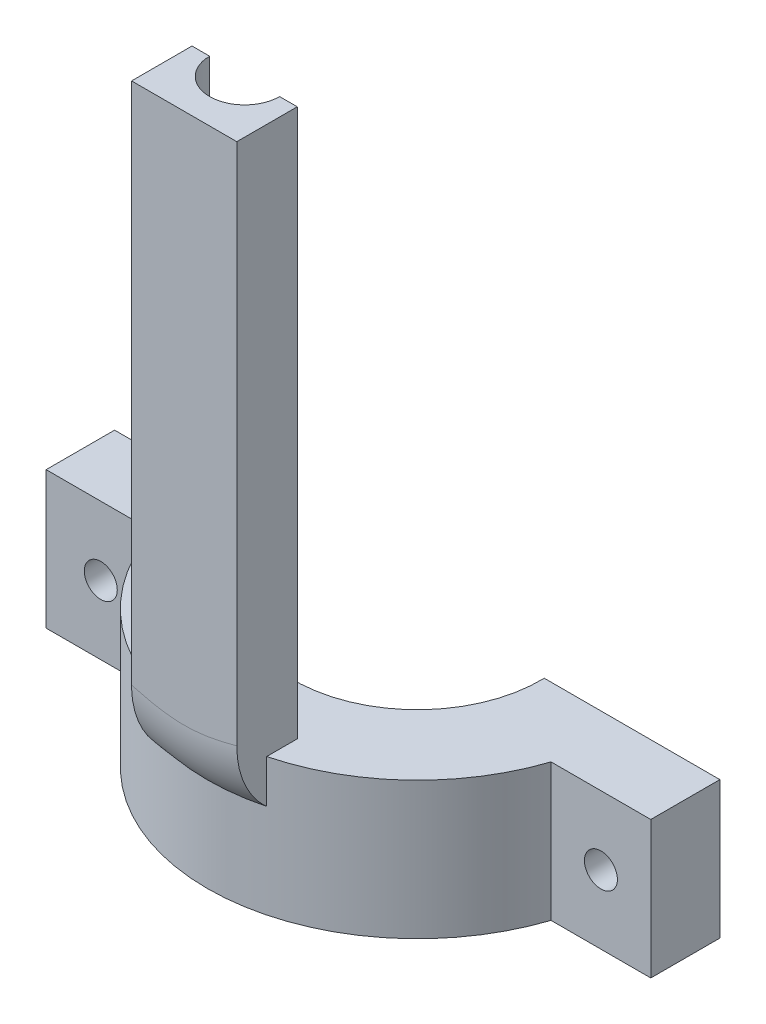
ISO-10303-21;
HEADER;
FILE_DESCRIPTION(('STEP AP214'),'2;1');
FILE_NAME('part.step','',(''),(''),'','','');
FILE_SCHEMA(('AUTOMOTIVE_DESIGN { 1 0 10303 214 1 1 1 1 }'));
ENDSEC;
DATA;
#1=APPLICATION_CONTEXT('core data for automotive mechanical design processes');
#2=APPLICATION_PROTOCOL_DEFINITION('international standard','automotive_design',2000,#1);
#3=PRODUCT_CONTEXT('',#1,'mechanical');
#4=PRODUCT('Part','Part','',(#3));
#5=PRODUCT_RELATED_PRODUCT_CATEGORY('part','',(#4));
#6=PRODUCT_DEFINITION_FORMATION('','',#4);
#7=PRODUCT_DEFINITION_CONTEXT('part definition',#1,'design');
#8=PRODUCT_DEFINITION('design','',#6,#7);
#9=PRODUCT_DEFINITION_SHAPE('','',#8);
#10=(LENGTH_UNIT() NAMED_UNIT(*) SI_UNIT(.MILLI.,.METRE.));
#11=(NAMED_UNIT(*) PLANE_ANGLE_UNIT() SI_UNIT($,.RADIAN.));
#12=(NAMED_UNIT(*) SI_UNIT($,.STERADIAN.) SOLID_ANGLE_UNIT());
#13=UNCERTAINTY_MEASURE_WITH_UNIT(LENGTH_MEASURE(1.E-05),#10,'distance_accuracy_value','');
#14=(GEOMETRIC_REPRESENTATION_CONTEXT(3) GLOBAL_UNCERTAINTY_ASSIGNED_CONTEXT((#13)) GLOBAL_UNIT_ASSIGNED_CONTEXT((#10,
#11,#12)) REPRESENTATION_CONTEXT('',''));
#15=CARTESIAN_POINT('',(0.,0.,0.));
#16=DIRECTION('',(0.,0.,1.));
#17=DIRECTION('',(1.,0.,0.));
#18=AXIS2_PLACEMENT_3D('',#15,#16,#17);
#19=CARTESIAN_POINT('',(0.,10.,0.));
#20=DIRECTION('',(0.,-1.,0.));
#21=DIRECTION('',(0.,0.,-1.));
#22=AXIS2_PLACEMENT_3D('',#19,#20,#21);
#23=CYLINDRICAL_SURFACE('',#22,24.32);
#24=CARTESIAN_POINT('',(0.,10.,0.));
#25=DIRECTION('',(0.,1.,0.));
#26=DIRECTION('',(1.,0.,0.));
#27=AXIS2_PLACEMENT_3D('',#24,#25,#26);
#28=CIRCLE('',#27,24.32);
#29=CARTESIAN_POINT('',(-23.1221453744989,10.,7.53848746636495));
#30=VERTEX_POINT('',#29);
#31=CARTESIAN_POINT('',(-6.09413412364548,10.,23.5440848045325));
#32=VERTEX_POINT('',#31);
#33=EDGE_CURVE('E254',#30,#32,#28,.T.);
#34=ORIENTED_EDGE('',*,*,#33,.F.);
#35=DIRECTION('',(0.,-1.,0.));
#36=VECTOR('',#35,1.);
#37=CARTESIAN_POINT('',(-23.1221453744989,10.,7.53848746636495));
#38=LINE('',#37,#36);
#39=CARTESIAN_POINT('',(-23.1221453744989,-5.9,7.53848746636495));
#40=VERTEX_POINT('',#39);
#41=EDGE_CURVE('E189',#30,#40,#38,.T.);
#42=ORIENTED_EDGE('',*,*,#41,.T.);
#43=CARTESIAN_POINT('',(0.,-5.9,0.));
#44=DIRECTION('',(0.,-1.,0.));
#45=DIRECTION('',(1.,0.,0.));
#46=AXIS2_PLACEMENT_3D('',#43,#44,#45);
#47=CIRCLE('',#46,24.32);
#48=CARTESIAN_POINT('',(23.0980347749765,-5.9,7.61204240227137));
#49=VERTEX_POINT('',#48);
#50=EDGE_CURVE('E214',#49,#40,#47,.T.);
#51=ORIENTED_EDGE('',*,*,#50,.F.);
#52=DIRECTION('',(0.,-1.,0.));
#53=VECTOR('',#52,1.);
#54=CARTESIAN_POINT('',(23.0980347749765,10.,7.61204240227137));
#55=LINE('',#54,#53);
#56=CARTESIAN_POINT('',(23.0980347749765,10.,7.61204240227137));
#57=VERTEX_POINT('',#56);
#58=EDGE_CURVE('E207',#49,#57,#55,.F.);
#59=ORIENTED_EDGE('',*,*,#58,.T.);
#60=CARTESIAN_POINT('',(6.09413412364551,10.,23.5440848045325));
#61=VERTEX_POINT('',#60);
#62=EDGE_CURVE('E255',#61,#57,#28,.T.);
#63=ORIENTED_EDGE('',*,*,#62,.F.);
#64=DIRECTION('',(0.,-1.,0.));
#65=VECTOR('',#64,1.);
#66=CARTESIAN_POINT('',(6.09413412364551,10.,23.5440848045325));
#67=LINE('',#66,#65);
#68=CARTESIAN_POINT('',(6.09413412364551,5.,23.5440848045325));
#69=VERTEX_POINT('',#68);
#70=EDGE_CURVE('E264',#61,#69,#67,.T.);
#71=ORIENTED_EDGE('',*,*,#70,.T.);
#72=CARTESIAN_POINT('',(0.,5.,0.));
#73=DIRECTION('',(0.,-1.,0.));
#74=DIRECTION('',(0.,0.,-1.));
#75=AXIS2_PLACEMENT_3D('',#72,#73,#74);
#76=CIRCLE('',#75,24.32);
#77=CARTESIAN_POINT('',(-6.09413412364548,5.,23.5440848045325));
#78=VERTEX_POINT('',#77);
#79=EDGE_CURVE('E261',#69,#78,#76,.T.);
#80=ORIENTED_EDGE('',*,*,#79,.T.);
#81=DIRECTION('',(0.,-1.,0.));
#82=VECTOR('',#81,1.);
#83=CARTESIAN_POINT('',(-6.09413412364548,10.,23.5440848045325));
#84=LINE('',#83,#82);
#85=EDGE_CURVE('E258',#78,#32,#84,.F.);
#86=ORIENTED_EDGE('',*,*,#85,.T.);
#87=EDGE_LOOP('',(#34,#42,#51,#59,#63,#71,#80,#86));
#88=FACE_BOUND('',#87,.T.);
#89=ADVANCED_FACE('F45',(#88),#23,.T.);
#90=CARTESIAN_POINT('',(0.,10.,0.));
#91=DIRECTION('',(0.,1.,0.));
#92=DIRECTION('',(0.,0.,1.));
#93=AXIS2_PLACEMENT_3D('',#90,#91,#92);
#94=PLANE('',#93);
#95=DIRECTION('',(1.,0.,0.));
#96=VECTOR('',#95,1.);
#97=CARTESIAN_POINT('',(34.65,10.,-0.387957597728635));
#98=LINE('',#97,#96);
#99=CARTESIAN_POINT('',(-35.45,10.,-0.387957597728635));
#100=VERTEX_POINT('',#99);
#101=CARTESIAN_POINT('',(-14.3147437595776,10.,-0.387957597728635));
#102=VERTEX_POINT('',#101);
#103=EDGE_CURVE('E160',#100,#102,#98,.T.);
#104=ORIENTED_EDGE('',*,*,#103,.F.);
#105=DIRECTION('',(0.,0.,1.));
#106=VECTOR('',#105,1.);
#107=CARTESIAN_POINT('',(-35.45,10.,-8.46151253363505));
#108=LINE('',#107,#106);
#109=CARTESIAN_POINT('',(-35.45,10.,7.53848746636495));
#110=VERTEX_POINT('',#109);
#111=EDGE_CURVE('E171',#100,#110,#108,.T.);
#112=ORIENTED_EDGE('',*,*,#111,.T.);
#113=DIRECTION('',(1.,0.,0.));
#114=VECTOR('',#113,1.);
#115=CARTESIAN_POINT('',(-35.45,10.,7.53848746636495));
#116=LINE('',#115,#114);
#117=EDGE_CURVE('E184',#110,#30,#116,.T.);
#118=ORIENTED_EDGE('',*,*,#117,.T.);
#119=ORIENTED_EDGE('',*,*,#33,.T.);
#120=DIRECTION('',(0.,0.,1.));
#121=VECTOR('',#120,1.);
#122=CARTESIAN_POINT('',(-6.09413412364548,10.,0.));
#123=LINE('',#122,#121);
#124=CARTESIAN_POINT('',(-6.09413412364548,10.,20.));
#125=VERTEX_POINT('',#124);
#126=EDGE_CURVE('E248',#125,#32,#123,.T.);
#127=ORIENTED_EDGE('',*,*,#126,.F.);
#128=DIRECTION('',(1.,0.,0.));
#129=VECTOR('',#128,1.);
#130=CARTESIAN_POINT('',(0.,10.,20.));
#131=LINE('',#130,#129);
#132=CARTESIAN_POINT('',(6.09413412364551,10.,20.));
#133=VERTEX_POINT('',#132);
#134=EDGE_CURVE('E267',#125,#133,#131,.T.);
#135=ORIENTED_EDGE('',*,*,#134,.T.);
#136=DIRECTION('',(0.,0.,-1.));
#137=VECTOR('',#136,1.);
#138=CARTESIAN_POINT('',(6.09413412364551,10.,0.));
#139=LINE('',#138,#137);
#140=EDGE_CURVE('E251',#61,#133,#139,.T.);
#141=ORIENTED_EDGE('',*,*,#140,.F.);
#142=ORIENTED_EDGE('',*,*,#62,.T.);
#143=DIRECTION('',(1.,0.,0.));
#144=VECTOR('',#143,1.);
#145=CARTESIAN_POINT('',(23.,10.,7.61204240227137));
#146=LINE('',#145,#144);
#147=CARTESIAN_POINT('',(34.65,10.,7.61204240227137));
#148=VERTEX_POINT('',#147);
#149=EDGE_CURVE('E204',#57,#148,#146,.T.);
#150=ORIENTED_EDGE('',*,*,#149,.T.);
#151=DIRECTION('',(0.,0.,1.));
#152=VECTOR('',#151,1.);
#153=CARTESIAN_POINT('',(34.65,10.,7.61204240227137));
#154=LINE('',#153,#152);
#155=CARTESIAN_POINT('',(34.65,10.,-0.387957597728635));
#156=VERTEX_POINT('',#155);
#157=EDGE_CURVE('E196',#156,#148,#154,.T.);
#158=ORIENTED_EDGE('',*,*,#157,.F.);
#159=CARTESIAN_POINT('',(14.3147437595776,10.,-0.387957597728635));
#160=VERTEX_POINT('',#159);
#161=EDGE_CURVE('E62',#160,#156,#98,.T.);
#162=ORIENTED_EDGE('',*,*,#161,.F.);
#163=CARTESIAN_POINT('',(0.,10.,0.));
#164=DIRECTION('',(0.,1.,0.));
#165=DIRECTION('',(0.,0.,1.));
#166=AXIS2_PLACEMENT_3D('',#163,#164,#165);
#167=CIRCLE('',#166,14.32);
#168=EDGE_CURVE('E174',#102,#160,#167,.T.);
#169=ORIENTED_EDGE('',*,*,#168,.F.);
#170=EDGE_LOOP('',(#104,#112,#118,#119,#127,#135,#141,#142,#150,#158,#162,#169));
#171=FACE_BOUND('',#170,.T.);
#172=ADVANCED_FACE('F169',(#171),#94,.T.);
#173=CARTESIAN_POINT('',(0.,10.,0.));
#174=DIRECTION('',(0.,-1.,0.));
#175=DIRECTION('',(0.,0.,-1.));
#176=AXIS2_PLACEMENT_3D('',#173,#174,#175);
#177=CYLINDRICAL_SURFACE('',#176,14.32);
#178=DIRECTION('',(0.,-1.,0.));
#179=VECTOR('',#178,1.);
#180=CARTESIAN_POINT('',(-14.3147437595776,10.,-0.387957597728635));
#181=LINE('',#180,#179);
#182=CARTESIAN_POINT('',(-14.3147437595776,-5.9,-0.387957597728635));
#183=VERTEX_POINT('',#182);
#184=EDGE_CURVE('E368',#102,#183,#181,.T.);
#185=ORIENTED_EDGE('',*,*,#184,.F.);
#186=ORIENTED_EDGE('',*,*,#168,.T.);
#187=DIRECTION('',(0.,-1.,0.));
#188=VECTOR('',#187,1.);
#189=CARTESIAN_POINT('',(14.3147437595776,10.,-0.387957597728635));
#190=LINE('',#189,#188);
#191=CARTESIAN_POINT('',(14.3147437595776,-5.9,-0.387957597728635));
#192=VERTEX_POINT('',#191);
#193=EDGE_CURVE('E367',#192,#160,#190,.F.);
#194=ORIENTED_EDGE('',*,*,#193,.F.);
#195=CARTESIAN_POINT('',(0.,-5.9,0.));
#196=DIRECTION('',(0.,-1.,0.));
#197=DIRECTION('',(0.,0.,-1.));
#198=AXIS2_PLACEMENT_3D('',#195,#196,#197);
#199=CIRCLE('',#198,14.32);
#200=EDGE_CURVE('E211',#192,#183,#199,.T.);
#201=ORIENTED_EDGE('',*,*,#200,.T.);
#202=EDGE_LOOP('',(#185,#186,#194,#201));
#203=FACE_BOUND('',#202,.T.);
#204=ADVANCED_FACE('F328',(#203),#177,.F.);
#205=CARTESIAN_POINT('',(6.09413412364551,11.3789067462464,20.));
#206=DIRECTION('',(1.,0.,0.));
#207=DIRECTION('',(0.,1.,0.));
#208=AXIS2_PLACEMENT_3D('',#205,#206,#207);
#209=PLANE('',#208);
#210=DIRECTION('',(0.,1.,0.));
#211=VECTOR('',#210,1.);
#212=CARTESIAN_POINT('',(6.09413412364551,0.,27.));
#213=LINE('',#212,#211);
#214=CARTESIAN_POINT('',(6.09413412364551,12.7976720228891,27.));
#215=VERTEX_POINT('',#214);
#216=CARTESIAN_POINT('',(6.09413412364551,73.3989067462464,27.));
#217=VERTEX_POINT('',#216);
#218=EDGE_CURVE('E220',#215,#217,#213,.T.);
#219=ORIENTED_EDGE('',*,*,#218,.F.);
#220=CARTESIAN_POINT('',(-11.5257785129935,5.,21.4153876843128));
#221=CARTESIAN_POINT('',(-10.7979053131753,7.65008264736126,27.));
#222=CARTESIAN_POINT('',(-9.14941314927273,13.6520078164162,27.));
#223=CARTESIAN_POINT('',(-11.3378264558306,5.,21.5165415273467));
#224=CARTESIAN_POINT('',(-10.5977190150874,7.67592773256537,27.));
#225=CARTESIAN_POINT('',(-8.95699097159141,13.5991609913679,27.));
#226=CARTESIAN_POINT('',(-11.1460319715212,5.,21.6165766212209));
#227=CARTESIAN_POINT('',(-10.3945121750637,7.69956177198486,27.));
#228=CARTESIAN_POINT('',(-8.76473479564352,13.5457180194451,27.));
#229=CARTESIAN_POINT('',(-10.7546503422947,5.,21.8139393115762));
#230=CARTESIAN_POINT('',(-9.98372044979291,7.7424773362833,27.));
#231=CARTESIAN_POINT('',(-8.38042645046281,13.4381092470189,27.));
#232=CARTESIAN_POINT('',(-10.5550632698645,5.,21.9112669332277));
#233=CARTESIAN_POINT('',(-9.77611351528495,7.76179325123868,27.));
#234=CARTESIAN_POINT('',(-8.18837427934939,13.3839434532422,27.));
#235=CARTESIAN_POINT('',(-9.94431907565416,5.,22.1985461577991));
#236=CARTESIAN_POINT('',(-9.14885213394715,7.81352290034882,27.));
#237=CARTESIAN_POINT('',(-7.61220657297191,13.22103063927,27.));
#238=CARTESIAN_POINT('',(-9.52129614779497,5.,22.3837303996122));
#239=CARTESIAN_POINT('',(-8.72069725784056,7.84021218154117,27.));
#240=CARTESIAN_POINT('',(-7.22819978185598,13.1119017558189,27.));
#241=CARTESIAN_POINT('',(-8.63772055262134,5.,22.7394315659862));
#242=CARTESIAN_POINT('',(-7.84353246652724,7.88048181034984,27.));
#243=CARTESIAN_POINT('',(-6.4544973196288,12.8955289411152,27.));
#244=CARTESIAN_POINT('',(-8.1767669787866,5.,22.9097377272702));
#245=CARTESIAN_POINT('',(-7.39387830488988,7.89407883854164,27.));
#246=CARTESIAN_POINT('',(-6.06479023399695,12.7883252617966,27.));
#247=CARTESIAN_POINT('',(-7.22238885506042,5.,23.2282682940278));
#248=CARTESIAN_POINT('',(-6.47972873308056,7.91107804287509,27.));
#249=CARTESIAN_POINT('',(-5.28314920889017,12.5823108903619,27.));
#250=CARTESIAN_POINT('',(-6.72896658300259,5.,23.3764942461572));
#251=CARTESIAN_POINT('',(-6.01469205068409,7.91459380433553,27.));
#252=CARTESIAN_POINT('',(-4.89121542738735,12.4834996105907,27.));
#253=CARTESIAN_POINT('',(-5.74213430572935,5.,23.6375702974723));
#254=CARTESIAN_POINT('',(-5.0991989162276,7.91522453305528,27.));
#255=CARTESIAN_POINT('',(-4.12772908649979,12.3055802622899,27.));
#256=CARTESIAN_POINT('',(-5.25051969719049,5.,23.7520151881606));
#257=CARTESIAN_POINT('',(-4.64915990929392,7.91275759321577,27.));
#258=CARTESIAN_POINT('',(-3.7563735538088,12.2256431141343,27.));
#259=CARTESIAN_POINT('',(-4.24350843771677,5.,23.9524188803053));
#260=CARTESIAN_POINT('',(-3.73858710128888,7.90542390752773,27.));
#261=CARTESIAN_POINT('',(-3.01022923457598,12.0834322522819,27.));
#262=CARTESIAN_POINT('',(-3.72811282241121,5.,24.0383789209053));
#263=CARTESIAN_POINT('',(-3.27732708083323,7.90056510345296,27.));
#264=CARTESIAN_POINT('',(-2.6354405981096,12.0211577702435,27.));
#265=CARTESIAN_POINT('',(-2.68205288137887,5.,24.1773797668994));
#266=CARTESIAN_POINT('',(-2.34949819349694,7.89141005855021,27.));
#267=CARTESIAN_POINT('',(-1.88477518632753,11.9194410274715,27.));
#268=CARTESIAN_POINT('',(-2.15148701818676,5.,24.2305973362875));
#269=CARTESIAN_POINT('',(-1.88213295811772,7.88710015542467,27.));
#270=CARTESIAN_POINT('',(-1.5089154585511,11.8798762449882,27.));
#271=CARTESIAN_POINT('',(-1.08060011106596,5.,24.3018991265428));
#272=CARTESIAN_POINT('',(-0.943633879149647,7.8811130465204,27.));
#273=CARTESIAN_POINT('',(-0.755360447939881,11.8266874539024,27.));
#274=CARTESIAN_POINT('',(-0.540280852320594,5.,24.3199897122641));
#275=CARTESIAN_POINT('',(-0.471553746109246,7.87942384710444,27.));
#276=CARTESIAN_POINT('',(-0.377665510073063,11.8130587458067,27.));
#277=CARTESIAN_POINT('',(0.415563524107193,5.,24.3200079129425));
#278=CARTESIAN_POINT('',(0.362701179995349,7.87941137976263,27.));
#279=CARTESIAN_POINT('',(0.290486214002005,11.8130367419587,27.));
#280=CARTESIAN_POINT('',(0.8311044053832,5.,24.3093193187234));
#281=CARTESIAN_POINT('',(0.725606103461193,7.88040091902309,27.));
#282=CARTESIAN_POINT('',(0.580955018191015,11.821082714053,27.));
#283=CARTESIAN_POINT('',(1.65769416774632,5.,24.2669658589697));
#284=CARTESIAN_POINT('',(1.44880197400916,7.88407079544688,27.));
#285=CARTESIAN_POINT('',(1.16102980376904,11.8527674989445,27.));
#286=CARTESIAN_POINT('',(2.06874311154208,5.,24.2353012866466));
#287=CARTESIAN_POINT('',(1.80952981199053,7.88675541626908,27.));
#288=CARTESIAN_POINT('',(1.45063579716197,11.8764060937811,27.));
#289=CARTESIAN_POINT('',(2.88317009452338,5.,24.1519713857434));
#290=CARTESIAN_POINT('',(2.52722407022133,7.89306424940141,27.));
#291=CARTESIAN_POINT('',(2.02889590033091,11.938023962612,27.));
#292=CARTESIAN_POINT('',(3.28653048164396,5.,24.100264765863));
#293=CARTESIAN_POINT('',(2.88458986166025,7.89669636292086,27.));
#294=CARTESIAN_POINT('',(2.31754679602359,11.9760328387406,27.));
#295=CARTESIAN_POINT('',(4.08149088350606,5.,23.9784400957139));
#296=CARTESIAN_POINT('',(3.59336443014339,7.9037643716686,27.));
#297=CARTESIAN_POINT('',(2.89292480748212,12.0644460865763,27.));
#298=CARTESIAN_POINT('',(4.47309046582008,5.,23.9083213693804));
#299=CARTESIAN_POINT('',(3.94514261545785,7.90720345465644,27.));
#300=CARTESIAN_POINT('',(3.17965185221051,12.1148509134399,27.));
#301=CARTESIAN_POINT('',(5.24676672237702,5.,23.7506127285437));
#302=CARTESIAN_POINT('',(4.64591289824626,7.91257599081615,27.));
#303=CARTESIAN_POINT('',(3.75451794238228,12.2264693804197,27.));
#304=CARTESIAN_POINT('',(5.62867399976538,5.,23.662824317033));
#305=CARTESIAN_POINT('',(4.99513431907046,7.91448622328467,27.));
#306=CARTESIAN_POINT('',(4.04263300900027,12.2878048234056,27.));
#307=CARTESIAN_POINT('',(6.37645925080079,5.,23.4723682214123));
#308=CARTESIAN_POINT('',(5.68579586342651,7.91526154361321,27.));
#309=CARTESIAN_POINT('',(4.61702251667094,12.4184692040789,27.));
#310=CARTESIAN_POINT('',(6.74233719171093,5.,23.3697005069161));
#311=CARTESIAN_POINT('',(6.02752017037396,7.91410938629137,27.));
#312=CARTESIAN_POINT('',(4.90329695396347,12.4877981580904,27.));
#313=CARTESIAN_POINT('',(7.45709579729326,5.,23.1515387584453));
#314=CARTESIAN_POINT('',(6.70272157893906,7.90730462878505,27.));
#315=CARTESIAN_POINT('',(5.47434408157181,12.6321381511431,27.));
#316=CARTESIAN_POINT('',(7.80597925436819,5.,23.0360468419421));
#317=CARTESIAN_POINT('',(7.03643649663669,7.90161943566868,27.));
#318=CARTESIAN_POINT('',(5.7591170116997,12.707148251492,27.));
#319=CARTESIAN_POINT('',(8.486411766998,5.,22.7941571157909));
#320=CARTESIAN_POINT('',(7.695389599701,7.88437280000831,27.));
#321=CARTESIAN_POINT('',(6.3277001282604,12.860748929855,27.));
#322=CARTESIAN_POINT('',(8.81796006391288,5.,22.667758829487));
#323=CARTESIAN_POINT('',(8.02081851853528,7.87275938890795,27.));
#324=CARTESIAN_POINT('',(6.6115102720513,12.9393396642875,27.));
#325=CARTESIAN_POINT('',(9.60794646268623,5.,22.3473483378961));
#326=CARTESIAN_POINT('',(8.80788790183403,7.8354989256142,27.));
#327=CARTESIAN_POINT('',(7.30545034445805,13.1336745537839,27.));
#328=CARTESIAN_POINT('',(10.0568419863004,5.,22.1483725068465));
#329=CARTESIAN_POINT('',(9.26361278658458,7.80581507039849,27.));
#330=CARTESIAN_POINT('',(7.71532537948436,13.2503200293014,27.));
#331=CARTESIAN_POINT('',(10.9186573699635,5.,21.7364543329056));
#332=CARTESIAN_POINT('',(10.1552969559165,7.72807585590867,27.));
#333=CARTESIAN_POINT('',(8.53555287321561,13.4819288867117,27.));
#334=CARTESIAN_POINT('',(11.3315774717249,5.,21.5235120838691));
#335=CARTESIAN_POINT('',(10.5915322303424,7.67971564006572,27.));
#336=CARTESIAN_POINT('',(8.94590532869407,13.5968922799018,27.));
#337=CARTESIAN_POINT('',(12.122111540638,5.,21.088388507643));
#338=CARTESIAN_POINT('',(11.4419267256464,7.56186856314251,27.));
#339=CARTESIAN_POINT('',(9.76777360161343,13.8205550845174,27.));
#340=CARTESIAN_POINT('',(12.4997699237135,5.,20.8662193269643));
#341=CARTESIAN_POINT('',(11.8562268269514,7.49202041802991,27.));
#342=CARTESIAN_POINT('',(10.1792872640511,13.9292623081575,27.));
#343=CARTESIAN_POINT('',(13.2218329772084,5.,20.4163283682558));
#344=CARTESIAN_POINT('',(12.6608171227804,7.32897006722193,27.));
#345=CARTESIAN_POINT('',(11.0048340525249,14.1366104894313,27.));
#346=CARTESIAN_POINT('',(13.5662407499274,5.,20.1886071107255));
#347=CARTESIAN_POINT('',(13.0510428358362,7.23531040819775,27.));
#348=CARTESIAN_POINT('',(11.4188669396769,14.2352523862143,27.));
#349=CARTESIAN_POINT('',(14.2166146357095,5.,19.7358542813804));
#350=CARTESIAN_POINT('',(13.7961577791428,7.02539908067278,27.));
#351=CARTESIAN_POINT('',(12.2412403734051,14.4169253816491,27.));
#352=CARTESIAN_POINT('',(14.5232376147369,5.,19.5108670753757));
#353=CARTESIAN_POINT('',(14.1515194793482,6.90913819811108,27.));
#354=CARTESIAN_POINT('',(12.649517148869,14.5002415116907,27.));
#355=CARTESIAN_POINT('',(15.1079069441431,5.,19.0617251652006));
#356=CARTESIAN_POINT('',(14.8321983869682,6.65218983909735,27.));
#357=CARTESIAN_POINT('',(13.4690000805409,14.6505508856329,27.));
#358=CARTESIAN_POINT('',(15.3859600338973,5.,18.8375702767749));
#359=CARTESIAN_POINT('',(15.1571186828981,6.51099494521716,27.));
#360=CARTESIAN_POINT('',(13.8802055213174,14.7175479841781,27.));
#361=CARTESIAN_POINT('',(15.9168605671712,5.,18.3912227233924));
#362=CARTESIAN_POINT('',(15.7742691190188,6.20350018597003,27.));
#363=CARTESIAN_POINT('',(14.7077720480141,14.8325038148615,27.));
#364=CARTESIAN_POINT('',(16.1695521967956,5.,18.1690490228353));
#365=CARTESIAN_POINT('',(16.065666600238,6.03655353391654,27.));
#366=CARTESIAN_POINT('',(15.1241492073163,14.8803496843054,27.));
#367=CARTESIAN_POINT('',(16.6498872369555,5.,17.7298923863052));
#368=CARTESIAN_POINT('',(16.608678102869,5.6797351936043,27.));
#369=CARTESIAN_POINT('',(15.9592447790688,14.953464067995,27.));
#370=CARTESIAN_POINT('',(16.8775071353252,5.,17.512914469631));
#371=CARTESIAN_POINT('',(16.8594589171032,5.48935939876723,27.));
#372=CARTESIAN_POINT('',(16.3779650086843,14.9787115450119,27.));
#373=CARTESIAN_POINT('',(17.0933620101143,5.,17.2996929218752));
#374=CARTESIAN_POINT('',(17.0847457723216,5.29071432087424,27.));
#375=CARTESIAN_POINT('',(16.7972435604315,14.9911209589483,27.));
#376=(BOUNDED_SURFACE() B_SPLINE_SURFACE(3,2,((#220,#221,#222),(#223,#224,#225),(#226,#227,
#228),(#229,#230,#231),(#232,#233,#234),(#235,#236,#237),(#238,#239,#240),(#241,#242,#243),
(#244,#245,#246),(#247,#248,#249),(#250,#251,#252),(#253,#254,#255),(#256,#257,#258),(#259,#260,
#261),(#262,#263,#264),(#265,#266,#267),(#268,#269,#270),(#271,#272,#273),(#274,#275,#276),
(#277,#278,#279),(#280,#281,#282),(#283,#284,#285),(#286,#287,#288),(#289,#290,#291),(#292,#293,
#294),(#295,#296,#297),(#298,#299,#300),(#301,#302,#303),(#304,#305,#306),(#307,#308,#309),
(#310,#311,#312),(#313,#314,#315),(#316,#317,#318),(#319,#320,#321),(#322,#323,#324),(#325,#326,
#327),(#328,#329,#330),(#331,#332,#333),(#334,#335,#336),(#337,#338,#339),(#340,#341,#342),
(#343,#344,#345),(#346,#347,#348),(#349,#350,#351),(#352,#353,#354),(#355,#356,#357),(#358,#359,
#360),(#361,#362,#363),(#364,#365,#366),(#367,#368,#369),(#370,#371,#372),(#373,#374,#375)),
.UNSPECIFIED.,.F.,.F.,.F.) B_SPLINE_SURFACE_WITH_KNOTS((4,2,2,2,2,2,2,2,2,2,2,2,2,2,2,2,2,2,2,2,
2,2,2,2,2,4),(3,3),(0.,0.598637638063259,1.19726970890481,2.39490748677136,3.60742174970605,
4.81985103950035,5.95912992204483,7.0983592373409,8.23138305165882,9.36420154790757,
10.2355232528285,11.1068327782861,11.9799470289141,12.8530933434642,13.7366588013224,
14.6202260636122,15.5036476517932,16.3871078689191,17.6655581094509,18.9439997596367,
20.220808714767,21.4974984275833,22.7472990501318,23.9968041760349,25.2535681842557,
26.5115009223817),(0.,1.),
.UNSPECIFIED.) GEOMETRIC_REPRESENTATION_ITEM() RATIONAL_B_SPLINE_SURFACE(((1.,0.848981380370406,
1.),(1.,0.851960104162169,1.),(1.,0.854890119508732,1.),(1.,0.860642332320329,1.),(1.,
0.863464530787797,1.),(1.,0.87175560616416,1.),(1.,0.877047090921714,1.),(1.,0.887128694214471,
1.),(1.,0.891911768572098,1.),(1.,0.900795848948668,1.),(1.,0.904896902743549,1.),(1.,
0.912080395262055,1.),(1.,0.915209362355742,1.),(1.,0.92066737828979,1.),(1.,0.922996461926721,
1.),(1.,0.92675375596845,1.),(1.,0.92818680441765,1.),(1.,0.930105326938213,1.),(1.,
0.930590972674832,1.),(1.,0.930591392418788,1.),(1.,0.930304401803108,1.),(1.,0.929165554328142,
1.),(1.,0.928313705364696,1.),(1.,0.926066856223371,1.),(1.,0.924670734682359,1.),(1.,
0.92137110832841,1.),(1.,0.919467584884403,1.),(1.,0.915169548192205,1.),(1.,0.912769447074718,
1.),(1.,0.907538014274169,1.),(1.,0.904706681710451,1.),(1.,0.898657930840795,1.),(1.,
0.89544057626594,1.),(1.,0.888661549670691,1.),(1.,0.885099862600647,1.),(1.,0.876011560668498,
1.),(1.,0.870318395213828,1.),(1.,0.858404452428389,1.),(1.,0.852183678643083,1.),(1.,
0.839321585680954,1.),(1.,0.832680813727687,1.),(1.,0.819062135256885,1.),(1.,0.812084260282563,
1.),(1.,0.798023239791262,1.),(1.,0.790945406751028,1.),(1.,0.776619336422862,1.),(1.,
0.769371139820125,1.),(1.,0.754728364851051,1.),(1.,0.747333180714455,1.),(1.,0.732495911441213,
1.),(1.,0.725053789084331,1.),(1.,0.717624307067258,1.))) REPRESENTATION_ITEM('') SURFACE());
#377=CARTESIAN_POINT('',(6.09413412364551,12.7976720228891,27.));
#378=CARTESIAN_POINT('',(6.09413412364551,12.500310705593,27.0000237814081));
#379=CARTESIAN_POINT('',(6.09413412364551,12.2029435797015,26.987644443875));
#380=CARTESIAN_POINT('',(6.09413412364551,11.6102402667461,26.9381788591193));
#381=CARTESIAN_POINT('',(6.09413412364551,11.314904300974,26.901089961594));
#382=CARTESIAN_POINT('',(6.09413412364551,10.7278958663134,26.8022246755159));
#383=CARTESIAN_POINT('',(6.09413412364551,10.4362301009889,26.7404084244937));
#384=CARTESIAN_POINT('',(6.09413412364551,9.85917478589366,26.5923797144169));
#385=CARTESIAN_POINT('',(6.09413412364551,9.57378478156022,26.5061690286022));
#386=CARTESIAN_POINT('',(6.09413412364551,9.01095498155348,26.3096449056227));
#387=CARTESIAN_POINT('',(6.09413412364551,8.73352736542074,26.1992965602526));
#388=CARTESIAN_POINT('',(6.09413412364551,8.1891703967419,25.9551921307754));
#389=CARTESIAN_POINT('',(6.09413412364551,7.92224076692379,25.8214366654045));
#390=CARTESIAN_POINT('',(6.09413412364551,7.4014757330077,25.531613799691));
#391=CARTESIAN_POINT('',(6.09413412364551,7.14761526118878,25.3755914575448));
#392=CARTESIAN_POINT('',(6.09413412364551,6.65453833371667,25.0420997432967));
#393=CARTESIAN_POINT('',(6.09413412364551,6.41531566998692,24.8646395595699));
#394=CARTESIAN_POINT('',(6.09413412364551,5.97198751799788,24.5045480164004));
#395=CARTESIAN_POINT('',(6.09413412364551,5.76660561932586,24.32348588087));
#396=CARTESIAN_POINT('',(6.09413412364551,5.37136668628468,23.9454588359929));
#397=CARTESIAN_POINT('',(6.09413412364551,5.18149703667217,23.7485071131502));
#398=CARTESIAN_POINT('',(6.09413412364551,5.,23.5440848045325));
#399=B_SPLINE_CURVE_WITH_KNOTS('',3,(#377,#378,#379,#380,#381,#382,#383,#384,#385,#386,#387,
#388,#389,#390,#391,#392,#393,#394,#395,#396,#397,#398),.UNSPECIFIED.,.F.,.F.,(4,2,2,2,2,2,2,2,
2,2,4),(0.,0.891835671203448,1.78376701448664,2.67714205470332,3.57045217185984,
4.46506284968667,5.35964988323486,6.25245168560562,7.14487217696328,7.96537462351203,
8.78520301801851),.UNSPECIFIED.);
#400=EDGE_CURVE('E54',#215,#69,#399,.T.);
#401=ORIENTED_EDGE('',*,*,#400,.T.);
#402=ORIENTED_EDGE('',*,*,#70,.F.);
#403=ORIENTED_EDGE('',*,*,#140,.T.);
#404=DIRECTION('',(0.,1.,0.));
#405=VECTOR('',#404,1.);
#406=CARTESIAN_POINT('',(6.09413412364551,11.3789067462464,20.));
#407=LINE('',#406,#405);
#408=CARTESIAN_POINT('',(6.09413412364551,73.3989067462464,20.));
#409=VERTEX_POINT('',#408);
#410=EDGE_CURVE('E242',#133,#409,#407,.T.);
#411=ORIENTED_EDGE('',*,*,#410,.T.);
#412=DIRECTION('',(0.,0.,-1.));
#413=VECTOR('',#412,1.);
#414=CARTESIAN_POINT('',(6.09413412364551,73.3989067462464,30.));
#415=LINE('',#414,#413);
#416=EDGE_CURVE('E236',#217,#409,#415,.T.);
#417=ORIENTED_EDGE('',*,*,#416,.F.);
#418=EDGE_LOOP('',(#219,#401,#402,#403,#411,#417));
#419=FACE_BOUND('',#418,.T.);
#420=ADVANCED_FACE('F321',(#419),#209,.T.);
#421=CARTESIAN_POINT('',(-6.09413412364548,11.3789067462464,20.));
#422=DIRECTION('',(-1.,0.,0.));
#423=DIRECTION('',(0.,-1.,0.));
#424=AXIS2_PLACEMENT_3D('',#421,#422,#423);
#425=PLANE('',#424);
#426=ORIENTED_EDGE('',*,*,#85,.F.);
#427=CARTESIAN_POINT('',(-6.09413412364548,5.,23.5440848045325));
#428=CARTESIAN_POINT('',(-6.09413412364548,5.19078530633039,23.7589773119342));
#429=CARTESIAN_POINT('',(-6.09413412364548,5.39083503066995,23.9656154575103));
#430=CARTESIAN_POINT('',(-6.09413412364548,5.80776589319235,24.3610782520297));
#431=CARTESIAN_POINT('',(-6.09413412364548,6.02464408628345,24.5499060051499));
#432=CARTESIAN_POINT('',(-6.09413412364548,6.47328208307407,24.9082634340577));
#433=CARTESIAN_POINT('',(-6.09413412364548,6.70502022031446,25.0778202500897));
#434=CARTESIAN_POINT('',(-6.09413412364548,7.18189837709107,25.3968963306469));
#435=CARTESIAN_POINT('',(-6.09413412364548,7.42703843125312,25.5464155433985));
#436=CARTESIAN_POINT('',(-6.09413412364548,7.92888306261844,25.8245185676986));
#437=CARTESIAN_POINT('',(-6.09413412364548,8.18558653933451,25.9531043661218));
#438=CARTESIAN_POINT('',(-6.09413412364548,8.70873621269769,26.1886392047283));
#439=CARTESIAN_POINT('',(-6.09413412364548,8.97518263439839,26.2955877447365));
#440=CARTESIAN_POINT('',(-6.09413412364548,9.51580280097528,26.4872412512993));
#441=CARTESIAN_POINT('',(-6.09413412364548,9.78997255215548,26.5719574884829));
#442=CARTESIAN_POINT('',(-6.09413412364548,10.3442023386851,26.7187941140433));
#443=CARTESIAN_POINT('',(-6.09413412364548,10.6242606609649,26.7809209803577));
#444=CARTESIAN_POINT('',(-6.09413412364548,11.2185248862446,26.8877402518758));
#445=CARTESIAN_POINT('',(-6.09413412364548,11.5331931261315,26.9298737687665));
#446=CARTESIAN_POINT('',(-6.09413412364548,12.1644758320544,26.9859960642662));
#447=CARTESIAN_POINT('',(-6.09413412364548,12.4810859336441,27.0000339200806));
#448=CARTESIAN_POINT('',(-6.09413412364548,12.7976720228891,27.));
#449=B_SPLINE_CURVE_WITH_KNOTS('',3,(#427,#428,#429,#430,#431,#432,#433,#434,#435,#436,#437,
#438,#439,#440,#441,#442,#443,#444,#445,#446,#447,#448),.UNSPECIFIED.,.F.,.F.,(4,2,2,2,2,2,2,2,
2,2,4),(0.,0.861794483039577,1.72343848511937,2.58385354571899,3.44427082943273,
4.30460639980183,5.16496185574588,6.02488030968054,6.88455197055993,7.83570744316245,
8.78519999220786),.UNSPECIFIED.);
#450=CARTESIAN_POINT('',(-6.09413412364548,12.7976720228891,27.));
#451=VERTEX_POINT('',#450);
#452=EDGE_CURVE('E12',#78,#451,#449,.T.);
#453=ORIENTED_EDGE('',*,*,#452,.T.);
#454=DIRECTION('',(0.,1.,0.));
#455=VECTOR('',#454,1.);
#456=CARTESIAN_POINT('',(-6.09413412364548,0.,27.));
#457=LINE('',#456,#455);
#458=CARTESIAN_POINT('',(-6.09413412364548,73.3989067462464,27.));
#459=VERTEX_POINT('',#458);
#460=EDGE_CURVE('E221',#451,#459,#457,.T.);
#461=ORIENTED_EDGE('',*,*,#460,.T.);
#462=DIRECTION('',(0.,0.,1.));
#463=VECTOR('',#462,1.);
#464=CARTESIAN_POINT('',(-6.09413412364548,73.3989067462464,30.));
#465=LINE('',#464,#463);
#466=CARTESIAN_POINT('',(-6.09413412364548,73.3989067462464,20.));
#467=VERTEX_POINT('',#466);
#468=EDGE_CURVE('E233',#467,#459,#465,.T.);
#469=ORIENTED_EDGE('',*,*,#468,.F.);
#470=DIRECTION('',(0.,-1.,0.));
#471=VECTOR('',#470,1.);
#472=CARTESIAN_POINT('',(-6.09413412364548,11.3789067462464,20.));
#473=LINE('',#472,#471);
#474=EDGE_CURVE('E245',#467,#125,#473,.T.);
#475=ORIENTED_EDGE('',*,*,#474,.T.);
#476=ORIENTED_EDGE('',*,*,#126,.T.);
#477=EDGE_LOOP('',(#426,#453,#461,#469,#475,#476));
#478=FACE_BOUND('',#477,.T.);
#479=ADVANCED_FACE('F317',(#478),#425,.T.);
#480=CARTESIAN_POINT('',(0.,0.,20.));
#481=DIRECTION('',(0.,0.,1.));
#482=DIRECTION('',(1.,0.,0.));
#483=AXIS2_PLACEMENT_3D('',#480,#481,#482);
#484=PLANE('',#483);
#485=DIRECTION('',(-1.,0.,0.));
#486=VECTOR('',#485,1.);
#487=CARTESIAN_POINT('',(0.,49.3989067462464,20.));
#488=LINE('',#487,#486);
#489=CARTESIAN_POINT('',(4.05000000000002,49.3989067462464,20.));
#490=VERTEX_POINT('',#489);
#491=CARTESIAN_POINT('',(-4.04999999999998,49.3989067462464,20.));
#492=VERTEX_POINT('',#491);
#493=EDGE_CURVE('E273',#490,#492,#488,.T.);
#494=ORIENTED_EDGE('',*,*,#493,.F.);
#495=DIRECTION('',(0.,1.,0.));
#496=VECTOR('',#495,1.);
#497=CARTESIAN_POINT('',(4.05000000000002,49.3989067462464,20.));
#498=LINE('',#497,#496);
#499=CARTESIAN_POINT('',(4.05000000000002,73.3989067462464,20.));
#500=VERTEX_POINT('',#499);
#501=EDGE_CURVE('E230',#490,#500,#498,.T.);
#502=ORIENTED_EDGE('',*,*,#501,.T.);
#503=DIRECTION('',(-1.,0.,0.));
#504=VECTOR('',#503,1.);
#505=CARTESIAN_POINT('',(-6.09413412364548,73.3989067462464,20.));
#506=LINE('',#505,#504);
#507=EDGE_CURVE('E239',#409,#500,#506,.T.);
#508=ORIENTED_EDGE('',*,*,#507,.F.);
#509=ORIENTED_EDGE('',*,*,#410,.F.);
#510=ORIENTED_EDGE('',*,*,#134,.F.);
#511=ORIENTED_EDGE('',*,*,#474,.F.);
#512=CARTESIAN_POINT('',(-4.04999999999998,73.3989067462464,20.));
#513=VERTEX_POINT('',#512);
#514=EDGE_CURVE('E238',#513,#467,#506,.T.);
#515=ORIENTED_EDGE('',*,*,#514,.F.);
#516=DIRECTION('',(0.,1.,0.));
#517=VECTOR('',#516,1.);
#518=CARTESIAN_POINT('',(-4.04999999999998,49.3989067462464,20.));
#519=LINE('',#518,#517);
#520=EDGE_CURVE('E227',#513,#492,#519,.F.);
#521=ORIENTED_EDGE('',*,*,#520,.T.);
#522=EDGE_LOOP('',(#494,#502,#508,#509,#510,#511,#515,#521));
#523=FACE_BOUND('',#522,.T.);
#524=ADVANCED_FACE('F320',(#523),#484,.F.);
#525=CARTESIAN_POINT('',(0.,73.3989067462464,0.));
#526=DIRECTION('',(0.,-1.,0.));
#527=DIRECTION('',(0.,0.,-1.));
#528=AXIS2_PLACEMENT_3D('',#525,#526,#527);
#529=PLANE('',#528);
#530=ORIENTED_EDGE('',*,*,#468,.T.);
#531=DIRECTION('',(-1.,0.,0.));
#532=VECTOR('',#531,1.);
#533=CARTESIAN_POINT('',(-6.09413412364548,73.3989067462464,27.));
#534=LINE('',#533,#532);
#535=EDGE_CURVE('E217',#217,#459,#534,.T.);
#536=ORIENTED_EDGE('',*,*,#535,.F.);
#537=ORIENTED_EDGE('',*,*,#416,.T.);
#538=ORIENTED_EDGE('',*,*,#507,.T.);
#539=CARTESIAN_POINT('',(0.,73.3989067462464,20.));
#540=DIRECTION('',(0.,-1.,0.));
#541=DIRECTION('',(0.,0.,-1.));
#542=AXIS2_PLACEMENT_3D('',#539,#540,#541);
#543=CIRCLE('',#542,4.05);
#544=EDGE_CURVE('E270',#500,#513,#543,.T.);
#545=ORIENTED_EDGE('',*,*,#544,.T.);
#546=ORIENTED_EDGE('',*,*,#514,.T.);
#547=EDGE_LOOP('',(#530,#536,#537,#538,#545,#546));
#548=FACE_BOUND('',#547,.T.);
#549=ADVANCED_FACE('F518',(#548),#529,.F.);
#550=CARTESIAN_POINT('',(0.,49.3989067462464,20.));
#551=DIRECTION('',(0.,1.,0.));
#552=DIRECTION('',(0.,0.,1.));
#553=AXIS2_PLACEMENT_3D('',#550,#551,#552);
#554=PLANE('',#553);
#555=ORIENTED_EDGE('',*,*,#493,.T.);
#556=CARTESIAN_POINT('',(0.,49.3989067462464,20.));
#557=DIRECTION('',(0.,1.,0.));
#558=DIRECTION('',(0.,0.,1.));
#559=AXIS2_PLACEMENT_3D('',#556,#557,#558);
#560=CIRCLE('',#559,4.05);
#561=EDGE_CURVE('E223',#492,#490,#560,.T.);
#562=ORIENTED_EDGE('',*,*,#561,.T.);
#563=EDGE_LOOP('',(#555,#562));
#564=FACE_BOUND('',#563,.T.);
#565=ADVANCED_FACE('F523',(#564),#554,.T.);
#566=CARTESIAN_POINT('',(0.,49.3989067462464,20.));
#567=DIRECTION('',(0.,1.,0.));
#568=DIRECTION('',(0.,0.,1.));
#569=AXIS2_PLACEMENT_3D('',#566,#567,#568);
#570=CYLINDRICAL_SURFACE('',#569,4.05);
#571=ORIENTED_EDGE('',*,*,#561,.F.);
#572=ORIENTED_EDGE('',*,*,#520,.F.);
#573=ORIENTED_EDGE('',*,*,#544,.F.);
#574=ORIENTED_EDGE('',*,*,#501,.F.);
#575=EDGE_LOOP('',(#571,#572,#573,#574));
#576=FACE_BOUND('',#575,.T.);
#577=ADVANCED_FACE('F494',(#576),#570,.F.);
#578=CARTESIAN_POINT('',(-6.09413412364548,0.,27.));
#579=DIRECTION('',(0.,0.,-1.));
#580=DIRECTION('',(-1.,0.,0.));
#581=AXIS2_PLACEMENT_3D('',#578,#579,#580);
#582=PLANE('',#581);
#583=ORIENTED_EDGE('',*,*,#460,.F.);
#584=CARTESIAN_POINT('',(-9.14941314927273,13.6520078164162,27.));
#585=CARTESIAN_POINT('',(-8.95699097159141,13.5991609913679,27.));
#586=CARTESIAN_POINT('',(-8.76473479564352,13.5457180194451,27.));
#587=CARTESIAN_POINT('',(-8.38042645046281,13.4381092470189,27.));
#588=CARTESIAN_POINT('',(-8.18837427934939,13.3839434532422,27.));
#589=CARTESIAN_POINT('',(-7.61220657297191,13.22103063927,27.));
#590=CARTESIAN_POINT('',(-7.22819978185598,13.1119017558189,27.));
#591=CARTESIAN_POINT('',(-6.4544973196288,12.8955289411152,27.));
#592=CARTESIAN_POINT('',(-6.06479023399695,12.7883252617966,27.));
#593=CARTESIAN_POINT('',(-5.28314920889017,12.5823108903619,27.));
#594=CARTESIAN_POINT('',(-4.89121542738735,12.4834996105907,27.));
#595=CARTESIAN_POINT('',(-4.12772908649979,12.3055802622899,27.));
#596=CARTESIAN_POINT('',(-3.7563735538088,12.2256431141343,27.));
#597=CARTESIAN_POINT('',(-3.01022923457598,12.0834322522819,27.));
#598=CARTESIAN_POINT('',(-2.6354405981096,12.0211577702435,27.));
#599=CARTESIAN_POINT('',(-1.88477518632753,11.9194410274715,27.));
#600=CARTESIAN_POINT('',(-1.5089154585511,11.8798762449882,27.));
#601=CARTESIAN_POINT('',(-0.75536044793988,11.8266874539024,27.));
#602=CARTESIAN_POINT('',(-0.377665510073064,11.8130587458067,27.));
#603=CARTESIAN_POINT('',(0.290486214002005,11.8130367419587,27.));
#604=CARTESIAN_POINT('',(0.580955018191015,11.821082714053,27.));
#605=CARTESIAN_POINT('',(1.16102980376904,11.8527674989445,27.));
#606=CARTESIAN_POINT('',(1.45063579716197,11.8764060937811,27.));
#607=CARTESIAN_POINT('',(2.02889590033091,11.938023962612,27.));
#608=CARTESIAN_POINT('',(2.31754679602359,11.9760328387406,27.));
#609=CARTESIAN_POINT('',(2.89292480748212,12.0644460865763,27.));
#610=CARTESIAN_POINT('',(3.17965185221051,12.1148509134399,27.));
#611=CARTESIAN_POINT('',(3.75451794238228,12.2264693804197,27.));
#612=CARTESIAN_POINT('',(4.04263300900027,12.2878048234056,27.));
#613=CARTESIAN_POINT('',(4.61702251667094,12.4184692040789,27.));
#614=CARTESIAN_POINT('',(4.90329695396347,12.4877981580904,27.));
#615=CARTESIAN_POINT('',(5.47434408157181,12.6321381511431,27.));
#616=CARTESIAN_POINT('',(5.7591170116997,12.707148251492,27.));
#617=CARTESIAN_POINT('',(6.3277001282604,12.860748929855,27.));
#618=CARTESIAN_POINT('',(6.61151027205129,12.9393396642875,27.));
#619=CARTESIAN_POINT('',(7.30545034445805,13.1336745537839,27.));
#620=CARTESIAN_POINT('',(7.71532537948436,13.2503200293014,27.));
#621=CARTESIAN_POINT('',(8.53555287321561,13.4819288867117,27.));
#622=CARTESIAN_POINT('',(8.94590532869407,13.5968922799018,27.));
#623=CARTESIAN_POINT('',(9.76777360161343,13.8205550845174,27.));
#624=CARTESIAN_POINT('',(10.1792872640511,13.9292623081575,27.));
#625=CARTESIAN_POINT('',(11.0048340525249,14.1366104894313,27.));
#626=CARTESIAN_POINT('',(11.4188669396769,14.2352523862143,27.));
#627=CARTESIAN_POINT('',(12.2412403734051,14.4169253816491,27.));
#628=CARTESIAN_POINT('',(12.649517148869,14.5002415116907,27.));
#629=CARTESIAN_POINT('',(13.4690000805409,14.6505508856329,27.));
#630=CARTESIAN_POINT('',(13.8802055213174,14.7175479841781,27.));
#631=CARTESIAN_POINT('',(14.7077720480141,14.8325038148615,27.));
#632=CARTESIAN_POINT('',(15.1241492073163,14.8803496843054,27.));
#633=CARTESIAN_POINT('',(15.9592447790688,14.953464067995,27.));
#634=CARTESIAN_POINT('',(16.3779650086843,14.9787115450119,27.));
#635=CARTESIAN_POINT('',(16.7972435604315,14.9911209589483,27.));
#636=B_SPLINE_CURVE_WITH_KNOTS('',3,(#584,#585,#586,#587,#588,#589,#590,#591,#592,#593,#594,
#595,#596,#597,#598,#599,#600,#601,#602,#603,#604,#605,#606,#607,#608,#609,#610,#611,#612,#613,
#614,#615,#616,#617,#618,#619,#620,#621,#622,#623,#624,#625,#626,#627,#628,#629,#630,#631,#632,
#633,#634,#635),.UNSPECIFIED.,.F.,.F.,(4,2,2,2,2,2,2,2,2,2,2,2,2,2,2,2,2,2,2,2,2,2,2,2,2,4),(0.,
0.598637638063259,1.19726970890481,2.39490748677136,3.60742174970605,4.81985103950035,
5.95912992204483,7.0983592373409,8.23138305165882,9.36420154790757,10.2355232528285,
11.1068327782861,11.9799470289141,12.8530933434642,13.7366588013224,14.6202260636122,
15.5036476517932,16.3871078689191,17.6655581094509,18.9439997596367,20.220808714767,
21.4974984275833,22.7472990501318,23.9968041760349,25.2535681842557,26.5115009223817),.UNSPECIFIED.);
#637=EDGE_CURVE('E275',#451,#215,#636,.T.);
#638=ORIENTED_EDGE('',*,*,#637,.T.);
#639=ORIENTED_EDGE('',*,*,#218,.T.);
#640=ORIENTED_EDGE('',*,*,#535,.T.);
#641=EDGE_LOOP('',(#583,#638,#639,#640));
#642=FACE_BOUND('',#641,.T.);
#643=ADVANCED_FACE('F288',(#642),#582,.F.);
#644=ORIENTED_EDGE('',*,*,#452,.F.);
#645=ORIENTED_EDGE('',*,*,#79,.F.);
#646=ORIENTED_EDGE('',*,*,#400,.F.);
#647=ORIENTED_EDGE('',*,*,#637,.F.);
#648=EDGE_LOOP('',(#644,#645,#646,#647));
#649=FACE_BOUND('',#648,.T.);
#650=ADVANCED_FACE('F296',(#649),#376,.T.);
#651=CARTESIAN_POINT('',(0.,-5.9,0.));
#652=DIRECTION('',(0.,-1.,0.));
#653=DIRECTION('',(0.,0.,-1.));
#654=AXIS2_PLACEMENT_3D('',#651,#652,#653);
#655=PLANE('',#654);
#656=DIRECTION('',(-1.,0.,0.));
#657=VECTOR('',#656,1.);
#658=CARTESIAN_POINT('',(0.,-5.9,-0.387957597728635));
#659=LINE('',#658,#657);
#660=CARTESIAN_POINT('',(34.65,-5.9,-0.387957597728635));
#661=VERTEX_POINT('',#660);
#662=EDGE_CURVE('E362',#661,#192,#659,.T.);
#663=ORIENTED_EDGE('',*,*,#662,.F.);
#664=DIRECTION('',(0.,0.,-1.));
#665=VECTOR('',#664,1.);
#666=CARTESIAN_POINT('',(34.65,-5.9,7.61204240227137));
#667=LINE('',#666,#665);
#668=CARTESIAN_POINT('',(34.65,-5.9,7.61204240227137));
#669=VERTEX_POINT('',#668);
#670=EDGE_CURVE('E201',#669,#661,#667,.T.);
#671=ORIENTED_EDGE('',*,*,#670,.F.);
#672=DIRECTION('',(1.,0.,0.));
#673=VECTOR('',#672,1.);
#674=CARTESIAN_POINT('',(23.,-5.9,7.61204240227137));
#675=LINE('',#674,#673);
#676=EDGE_CURVE('E205',#49,#669,#675,.T.);
#677=ORIENTED_EDGE('',*,*,#676,.F.);
#678=ORIENTED_EDGE('',*,*,#50,.T.);
#679=DIRECTION('',(1.,0.,0.));
#680=VECTOR('',#679,1.);
#681=CARTESIAN_POINT('',(-35.45,-5.9,7.53848746636495));
#682=LINE('',#681,#680);
#683=CARTESIAN_POINT('',(-35.45,-5.9,7.53848746636495));
#684=VERTEX_POINT('',#683);
#685=EDGE_CURVE('E181',#684,#40,#682,.T.);
#686=ORIENTED_EDGE('',*,*,#685,.F.);
#687=DIRECTION('',(0.,0.,-1.));
#688=VECTOR('',#687,1.);
#689=CARTESIAN_POINT('',(-35.45,-5.9,-8.46151253363505));
#690=LINE('',#689,#688);
#691=CARTESIAN_POINT('',(-35.45,-5.9,-0.387957597728635));
#692=VERTEX_POINT('',#691);
#693=EDGE_CURVE('E182',#684,#692,#690,.T.);
#694=ORIENTED_EDGE('',*,*,#693,.T.);
#695=EDGE_CURVE('E70',#183,#692,#659,.T.);
#696=ORIENTED_EDGE('',*,*,#695,.F.);
#697=ORIENTED_EDGE('',*,*,#200,.F.);
#698=EDGE_LOOP('',(#663,#671,#677,#678,#686,#694,#696,#697));
#699=FACE_BOUND('',#698,.T.);
#700=ADVANCED_FACE('F300',(#699),#655,.T.);
#701=CARTESIAN_POINT('',(23.,10.,7.61204240227137));
#702=DIRECTION('',(0.,0.,1.));
#703=DIRECTION('',(0.,-1.,0.));
#704=AXIS2_PLACEMENT_3D('',#701,#702,#703);
#705=PLANE('',#704);
#706=CARTESIAN_POINT('',(28.8740173874912,2.0499999999985,7.61204240227137));
#707=DIRECTION('',(0.,0.,1.));
#708=DIRECTION('',(1.,0.,0.));
#709=AXIS2_PLACEMENT_3D('',#706,#707,#708);
#710=CIRCLE('',#709,1.91);
#711=CARTESIAN_POINT('',(30.7840173874912,2.0499999999985,7.61204240227137));
#712=VERTEX_POINT('',#711);
#713=EDGE_CURVE('E193',#712,#712,#710,.T.);
#714=ORIENTED_EDGE('',*,*,#713,.F.);
#715=EDGE_LOOP('',(#714));
#716=FACE_BOUND('',#715,.T.);
#717=ORIENTED_EDGE('',*,*,#58,.F.);
#718=ORIENTED_EDGE('',*,*,#676,.T.);
#719=DIRECTION('',(0.,-1.,0.));
#720=VECTOR('',#719,1.);
#721=CARTESIAN_POINT('',(34.65,10.,7.61204240227137));
#722=LINE('',#721,#720);
#723=EDGE_CURVE('E198',#148,#669,#722,.T.);
#724=ORIENTED_EDGE('',*,*,#723,.F.);
#725=ORIENTED_EDGE('',*,*,#149,.F.);
#726=EDGE_LOOP('',(#717,#718,#724,#725));
#727=FACE_BOUND('',#726,.T.);
#728=ADVANCED_FACE('F356',(#716,#727),#705,.T.);
#729=CARTESIAN_POINT('',(34.65,0.,0.));
#730=DIRECTION('',(1.,0.,0.));
#731=DIRECTION('',(0.,0.,-1.));
#732=AXIS2_PLACEMENT_3D('',#729,#730,#731);
#733=PLANE('',#732);
#734=DIRECTION('',(0.,1.,0.));
#735=VECTOR('',#734,1.);
#736=CARTESIAN_POINT('',(34.65,-25.45,-0.387957597728635));
#737=LINE('',#736,#735);
#738=EDGE_CURVE('E175',#661,#156,#737,.T.);
#739=ORIENTED_EDGE('',*,*,#738,.T.);
#740=ORIENTED_EDGE('',*,*,#157,.T.);
#741=ORIENTED_EDGE('',*,*,#723,.T.);
#742=ORIENTED_EDGE('',*,*,#670,.T.);
#743=EDGE_LOOP('',(#739,#740,#741,#742));
#744=FACE_BOUND('',#743,.T.);
#745=ADVANCED_FACE('F364',(#744),#733,.T.);
#746=CARTESIAN_POINT('',(28.8740173874912,2.0499999999985,-17.1879575977286));
#747=DIRECTION('',(0.,0.,1.));
#748=DIRECTION('',(1.,0.,0.));
#749=AXIS2_PLACEMENT_3D('',#746,#747,#748);
#750=CYLINDRICAL_SURFACE('',#749,1.91);
#751=CARTESIAN_POINT('',(28.8740173874912,2.0499999999985,-0.387957597728635));
#752=DIRECTION('',(0.,0.,1.));
#753=DIRECTION('',(1.,0.,0.));
#754=AXIS2_PLACEMENT_3D('',#751,#752,#753);
#755=CIRCLE('',#754,1.91);
#756=CARTESIAN_POINT('',(30.7840173874912,2.0499999999985,-0.387957597728635));
#757=VERTEX_POINT('',#756);
#758=EDGE_CURVE('E369',#757,#757,#755,.F.);
#759=CARTESIAN_POINT('',(30.7840173874912,2.0499999999985,-0.387957597728635));
#760=CARTESIAN_POINT('',(30.7840173874912,2.0499999999985,-0.304624264395302));
#761=CARTESIAN_POINT('',(30.7840173874912,2.0499999999985,-0.221290931061968));
#762=CARTESIAN_POINT('',(30.7840173874912,2.0499999999985,-0.0546242643953015));
#763=CARTESIAN_POINT('',(30.7840173874912,2.0499999999985,0.0287090689380318));
#764=CARTESIAN_POINT('',(30.7840173874912,2.0499999999985,0.195375735604699));
#765=CARTESIAN_POINT('',(30.7840173874912,2.0499999999985,0.278709068938032));
#766=CARTESIAN_POINT('',(30.7840173874912,2.0499999999985,0.445375735604699));
#767=CARTESIAN_POINT('',(30.7840173874912,2.0499999999985,0.528709068938032));
#768=CARTESIAN_POINT('',(30.7840173874912,2.0499999999985,0.695375735604699));
#769=CARTESIAN_POINT('',(30.7840173874912,2.0499999999985,0.778709068938032));
#770=CARTESIAN_POINT('',(30.7840173874912,2.0499999999985,0.945375735604699));
#771=CARTESIAN_POINT('',(30.7840173874912,2.0499999999985,1.02870906893803));
#772=CARTESIAN_POINT('',(30.7840173874912,2.0499999999985,1.1953757356047));
#773=CARTESIAN_POINT('',(30.7840173874912,2.0499999999985,1.27870906893803));
#774=CARTESIAN_POINT('',(30.7840173874912,2.0499999999985,1.4453757356047));
#775=CARTESIAN_POINT('',(30.7840173874912,2.0499999999985,1.52870906893803));
#776=CARTESIAN_POINT('',(30.7840173874912,2.0499999999985,1.6953757356047));
#777=CARTESIAN_POINT('',(30.7840173874912,2.0499999999985,1.77870906893803));
#778=CARTESIAN_POINT('',(30.7840173874912,2.0499999999985,1.9453757356047));
#779=CARTESIAN_POINT('',(30.7840173874912,2.0499999999985,2.02870906893803));
#780=CARTESIAN_POINT('',(30.7840173874912,2.0499999999985,2.1953757356047));
#781=CARTESIAN_POINT('',(30.7840173874912,2.0499999999985,2.27870906893803));
#782=CARTESIAN_POINT('',(30.7840173874912,2.0499999999985,2.4453757356047));
#783=CARTESIAN_POINT('',(30.7840173874912,2.0499999999985,2.52870906893803));
#784=CARTESIAN_POINT('',(30.7840173874912,2.0499999999985,2.6953757356047));
#785=CARTESIAN_POINT('',(30.7840173874912,2.0499999999985,2.77870906893803));
#786=CARTESIAN_POINT('',(30.7840173874912,2.0499999999985,2.9453757356047));
#787=CARTESIAN_POINT('',(30.7840173874912,2.0499999999985,3.02870906893803));
#788=CARTESIAN_POINT('',(30.7840173874912,2.0499999999985,3.1953757356047));
#789=CARTESIAN_POINT('',(30.7840173874912,2.0499999999985,3.27870906893803));
#790=CARTESIAN_POINT('',(30.7840173874912,2.0499999999985,3.4453757356047));
#791=CARTESIAN_POINT('',(30.7840173874912,2.0499999999985,3.52870906893803));
#792=CARTESIAN_POINT('',(30.7840173874912,2.0499999999985,3.6953757356047));
#793=CARTESIAN_POINT('',(30.7840173874912,2.0499999999985,3.77870906893803));
#794=CARTESIAN_POINT('',(30.7840173874912,2.0499999999985,3.9453757356047));
#795=CARTESIAN_POINT('',(30.7840173874912,2.0499999999985,4.02870906893803));
#796=CARTESIAN_POINT('',(30.7840173874912,2.0499999999985,4.1953757356047));
#797=CARTESIAN_POINT('',(30.7840173874912,2.0499999999985,4.27870906893803));
#798=CARTESIAN_POINT('',(30.7840173874912,2.0499999999985,4.4453757356047));
#799=CARTESIAN_POINT('',(30.7840173874912,2.0499999999985,4.52870906893803));
#800=CARTESIAN_POINT('',(30.7840173874912,2.0499999999985,4.6953757356047));
#801=CARTESIAN_POINT('',(30.7840173874912,2.0499999999985,4.77870906893803));
#802=CARTESIAN_POINT('',(30.7840173874912,2.0499999999985,4.9453757356047));
#803=CARTESIAN_POINT('',(30.7840173874912,2.0499999999985,5.02870906893803));
#804=CARTESIAN_POINT('',(30.7840173874912,2.0499999999985,5.1953757356047));
#805=CARTESIAN_POINT('',(30.7840173874912,2.0499999999985,5.27870906893803));
#806=CARTESIAN_POINT('',(30.7840173874912,2.0499999999985,5.4453757356047));
#807=CARTESIAN_POINT('',(30.7840173874912,2.0499999999985,5.52870906893803));
#808=CARTESIAN_POINT('',(30.7840173874912,2.0499999999985,5.6953757356047));
#809=CARTESIAN_POINT('',(30.7840173874912,2.0499999999985,5.77870906893803));
#810=CARTESIAN_POINT('',(30.7840173874912,2.0499999999985,5.9453757356047));
#811=CARTESIAN_POINT('',(30.7840173874912,2.0499999999985,6.02870906893803));
#812=CARTESIAN_POINT('',(30.7840173874912,2.0499999999985,6.1953757356047));
#813=CARTESIAN_POINT('',(30.7840173874912,2.0499999999985,6.27870906893803));
#814=CARTESIAN_POINT('',(30.7840173874912,2.0499999999985,6.4453757356047));
#815=CARTESIAN_POINT('',(30.7840173874912,2.0499999999985,6.52870906893803));
#816=CARTESIAN_POINT('',(30.7840173874912,2.0499999999985,6.6953757356047));
#817=CARTESIAN_POINT('',(30.7840173874912,2.0499999999985,6.77870906893803));
#818=CARTESIAN_POINT('',(30.7840173874912,2.0499999999985,6.9453757356047));
#819=CARTESIAN_POINT('',(30.7840173874912,2.0499999999985,7.02870906893803));
#820=CARTESIAN_POINT('',(30.7840173874912,2.0499999999985,7.1953757356047));
#821=CARTESIAN_POINT('',(30.7840173874912,2.0499999999985,7.27870906893803));
#822=CARTESIAN_POINT('',(30.7840173874912,2.0499999999985,7.4453757356047));
#823=CARTESIAN_POINT('',(30.7840173874912,2.0499999999985,7.52870906893803));
#824=CARTESIAN_POINT('',(30.7840173874912,2.0499999999985,7.61204240227137));
#825=B_SPLINE_CURVE_WITH_KNOTS('',3,(#759,#760,#761,#762,#763,#764,#765,#766,#767,#768,#769,
#770,#771,#772,#773,#774,#775,#776,#777,#778,#779,#780,#781,#782,#783,#784,#785,#786,#787,#788,
#789,#790,#791,#792,#793,#794,#795,#796,#797,#798,#799,#800,#801,#802,#803,#804,#805,#806,#807,
#808,#809,#810,#811,#812,#813,#814,#815,#816,#817,#818,#819,#820,#821,#822,#823,#824),
.UNSPECIFIED.,.F.,.F.,(4,2,2,2,2,2,2,2,2,2,2,2,2,2,2,2,2,2,2,2,2,2,2,2,2,2,2,2,2,2,2,2,4),(0.,
0.25,0.5,0.750000000000001,1.,1.25,1.5,1.75,2.,2.25,2.5,2.75,3.,3.25,3.5,3.75,4.,4.25,4.5,4.75,
5.,5.25,5.5,5.75,6.,6.25,6.5,6.75,7.,7.25,7.5,7.75,8.),.UNSPECIFIED.);
#826=EDGE_CURVE('BSEAM381',#757,#712,#825,.T.);
#827=ORIENTED_EDGE('',*,*,#758,.T.);
#828=ORIENTED_EDGE('',*,*,#713,.T.);
#829=ORIENTED_EDGE('',*,*,#826,.T.);
#830=ORIENTED_EDGE('',*,*,#826,.F.);
#831=EDGE_LOOP('',(#827,#829,#828,#830));
#832=FACE_BOUND('',#831,.T.);
#833=ADVANCED_FACE('F381',(#832),#750,.F.);
#834=CARTESIAN_POINT('',(-35.45,10.,7.53848746636495));
#835=DIRECTION('',(0.,0.,1.));
#836=DIRECTION('',(1.,0.,0.));
#837=AXIS2_PLACEMENT_3D('',#834,#835,#836);
#838=PLANE('',#837);
#839=CARTESIAN_POINT('',(-29.1197974973159,2.05,7.53848746636495));
#840=DIRECTION('',(0.,0.,1.));
#841=DIRECTION('',(1.,0.,0.));
#842=AXIS2_PLACEMENT_3D('',#839,#840,#841);
#843=CIRCLE('',#842,1.91);
#844=CARTESIAN_POINT('',(-27.2097974973159,2.05,7.53848746636495));
#845=VERTEX_POINT('',#844);
#846=EDGE_CURVE('E376',#845,#845,#843,.T.);
#847=ORIENTED_EDGE('',*,*,#846,.F.);
#848=EDGE_LOOP('',(#847));
#849=FACE_BOUND('',#848,.T.);
#850=ORIENTED_EDGE('',*,*,#41,.F.);
#851=ORIENTED_EDGE('',*,*,#117,.F.);
#852=DIRECTION('',(0.,-1.,0.));
#853=VECTOR('',#852,1.);
#854=CARTESIAN_POINT('',(-35.45,10.,7.53848746636495));
#855=LINE('',#854,#853);
#856=EDGE_CURVE('E180',#110,#684,#855,.T.);
#857=ORIENTED_EDGE('',*,*,#856,.T.);
#858=ORIENTED_EDGE('',*,*,#685,.T.);
#859=EDGE_LOOP('',(#850,#851,#857,#858));
#860=FACE_BOUND('',#859,.T.);
#861=ADVANCED_FACE('F379',(#849,#860),#838,.T.);
#862=CARTESIAN_POINT('',(-35.45,0.,0.));
#863=DIRECTION('',(-1.,0.,0.));
#864=DIRECTION('',(0.,0.,1.));
#865=AXIS2_PLACEMENT_3D('',#862,#863,#864);
#866=PLANE('',#865);
#867=DIRECTION('',(0.,1.,0.));
#868=VECTOR('',#867,1.);
#869=CARTESIAN_POINT('',(-35.45,0.,-0.387957597728635));
#870=LINE('',#869,#868);
#871=EDGE_CURVE('E156',#692,#100,#870,.T.);
#872=ORIENTED_EDGE('',*,*,#871,.F.);
#873=ORIENTED_EDGE('',*,*,#693,.F.);
#874=ORIENTED_EDGE('',*,*,#856,.F.);
#875=ORIENTED_EDGE('',*,*,#111,.F.);
#876=EDGE_LOOP('',(#872,#873,#874,#875));
#877=FACE_BOUND('',#876,.T.);
#878=ADVANCED_FACE('F178',(#877),#866,.T.);
#879=CARTESIAN_POINT('',(-29.1197974973159,2.05,26.9884874663649));
#880=DIRECTION('',(0.,0.,-1.));
#881=DIRECTION('',(-1.,0.,0.));
#882=AXIS2_PLACEMENT_3D('',#879,#880,#881);
#883=CYLINDRICAL_SURFACE('',#882,1.91);
#884=CARTESIAN_POINT('',(-29.1197974973159,2.05,-0.387957597728635));
#885=DIRECTION('',(0.,0.,1.));
#886=DIRECTION('',(1.,0.,0.));
#887=AXIS2_PLACEMENT_3D('',#884,#885,#886);
#888=CIRCLE('',#887,1.91);
#889=CARTESIAN_POINT('',(-27.2097974973159,2.05,-0.387957597728635));
#890=VERTEX_POINT('',#889);
#891=EDGE_CURVE('E49',#890,#890,#888,.F.);
#892=ORIENTED_EDGE('',*,*,#891,.T.);
#893=EDGE_LOOP('',(#892));
#894=FACE_BOUND('',#893,.T.);
#895=ORIENTED_EDGE('',*,*,#846,.T.);
#896=EDGE_LOOP('',(#895));
#897=FACE_BOUND('',#896,.T.);
#898=ADVANCED_FACE('F388',(#894,#897),#883,.F.);
#899=CARTESIAN_POINT('',(34.65,-25.45,-0.387957597728635));
#900=DIRECTION('',(0.,0.,1.));
#901=DIRECTION('',(1.,0.,0.));
#902=AXIS2_PLACEMENT_3D('',#899,#900,#901);
#903=PLANE('',#902);
#904=ORIENTED_EDGE('',*,*,#184,.T.);
#905=ORIENTED_EDGE('',*,*,#695,.T.);
#906=ORIENTED_EDGE('',*,*,#871,.T.);
#907=ORIENTED_EDGE('',*,*,#103,.T.);
#908=EDGE_LOOP('',(#904,#905,#906,#907));
#909=FACE_BOUND('',#908,.T.);
#910=ORIENTED_EDGE('',*,*,#891,.F.);
#911=EDGE_LOOP('',(#910));
#912=FACE_BOUND('',#911,.T.);
#913=ADVANCED_FACE('F158',(#909,#912),#903,.F.);
#914=ORIENTED_EDGE('',*,*,#193,.T.);
#915=ORIENTED_EDGE('',*,*,#161,.T.);
#916=ORIENTED_EDGE('',*,*,#738,.F.);
#917=ORIENTED_EDGE('',*,*,#662,.T.);
#918=EDGE_LOOP('',(#914,#915,#916,#917));
#919=FACE_BOUND('',#918,.T.);
#920=ORIENTED_EDGE('',*,*,#758,.F.);
#921=EDGE_LOOP('',(#920));
#922=FACE_BOUND('',#921,.T.);
#923=ADVANCED_FACE('F428',(#919,#922),#903,.F.);
#924=CLOSED_SHELL('',(#89,#172,#204,#420,#479,#524,#549,#565,#577,#643,#650,#700,#728,#745,#833,
#861,#878,#898,#913,#923));
#925=MANIFOLD_SOLID_BREP('B2',#924);
#926=ADVANCED_BREP_SHAPE_REPRESENTATION('',(#18,#925),#14);
#927=SHAPE_DEFINITION_REPRESENTATION(#9,#926);
ENDSEC;
END-ISO-10303-21;
